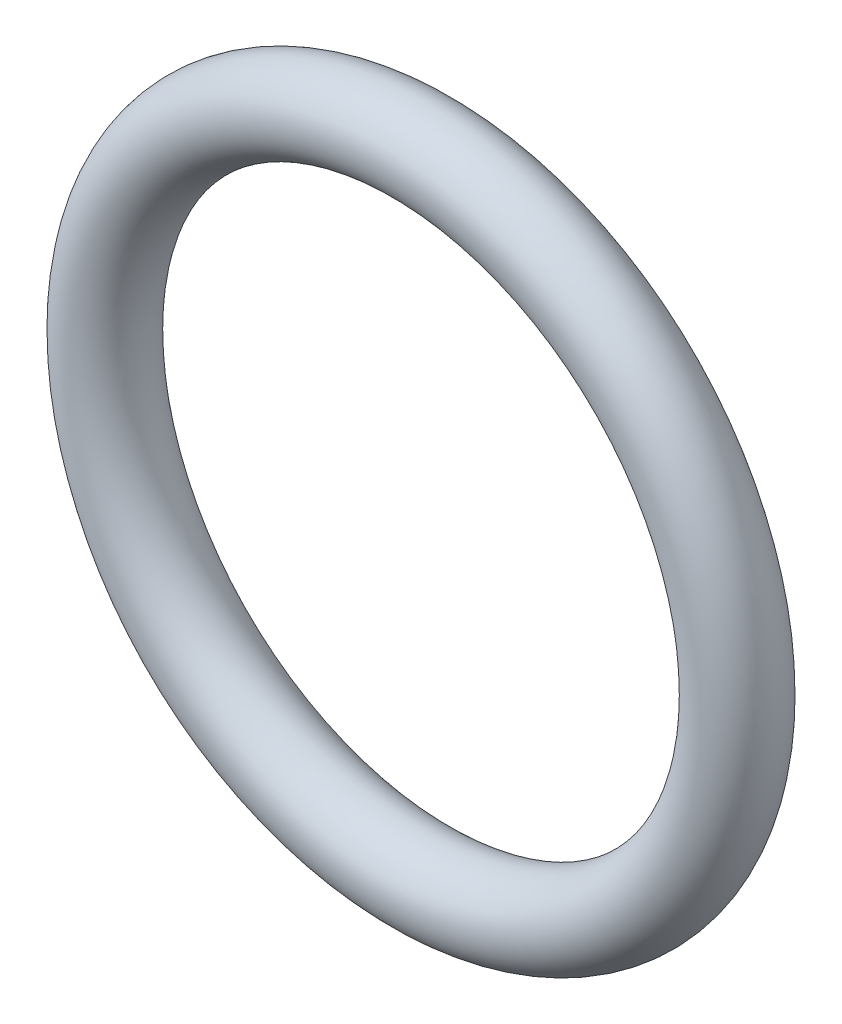
ISO-10303-21;
HEADER;
FILE_DESCRIPTION(('STEP AP214'),'2;1');
FILE_NAME('part.step','',(''),(''),'','','');
FILE_SCHEMA(('AUTOMOTIVE_DESIGN { 1 0 10303 214 1 1 1 1 }'));
ENDSEC;
DATA;
#1=APPLICATION_CONTEXT('core data for automotive mechanical design processes');
#2=APPLICATION_PROTOCOL_DEFINITION('international standard','automotive_design',2000,#1);
#3=PRODUCT_CONTEXT('',#1,'mechanical');
#4=PRODUCT('Part','Part','',(#3));
#5=PRODUCT_RELATED_PRODUCT_CATEGORY('part','',(#4));
#6=PRODUCT_DEFINITION_FORMATION('','',#4);
#7=PRODUCT_DEFINITION_CONTEXT('part definition',#1,'design');
#8=PRODUCT_DEFINITION('design','',#6,#7);
#9=PRODUCT_DEFINITION_SHAPE('','',#8);
#10=(LENGTH_UNIT() NAMED_UNIT(*) SI_UNIT(.MILLI.,.METRE.));
#11=(NAMED_UNIT(*) PLANE_ANGLE_UNIT() SI_UNIT($,.RADIAN.));
#12=(NAMED_UNIT(*) SI_UNIT($,.STERADIAN.) SOLID_ANGLE_UNIT());
#13=UNCERTAINTY_MEASURE_WITH_UNIT(LENGTH_MEASURE(1.E-05),#10,'distance_accuracy_value','');
#14=(GEOMETRIC_REPRESENTATION_CONTEXT(3) GLOBAL_UNCERTAINTY_ASSIGNED_CONTEXT((#13)) GLOBAL_UNIT_ASSIGNED_CONTEXT((#10,
#11,#12)) REPRESENTATION_CONTEXT('',''));
#15=CARTESIAN_POINT('',(0.,0.,0.));
#16=DIRECTION('',(0.,0.,1.));
#17=DIRECTION('',(1.,0.,0.));
#18=AXIS2_PLACEMENT_3D('',#15,#16,#17);
#19=CARTESIAN_POINT('',(0.,0.,0.));
#20=DIRECTION('',(0.,0.,-1.));
#21=DIRECTION('',(-1.,0.,0.));
#22=AXIS2_PLACEMENT_3D('',#19,#20,#21);
#23=TOROIDAL_SURFACE('',#22,14.224,1.84149999999999);
#24=CARTESIAN_POINT('',(-16.0655,0.,0.));
#25=VERTEX_POINT('',#24);
#26=VERTEX_LOOP('',#25);
#27=FACE_BOUND('',#26,.T.);
#28=ADVANCED_FACE('F28',(#27),#23,.T.);
#29=CLOSED_SHELL('',(#28));
#30=MANIFOLD_SOLID_BREP('B2',#29);
#31=ADVANCED_BREP_SHAPE_REPRESENTATION('',(#18,#30),#14);
#32=SHAPE_DEFINITION_REPRESENTATION(#9,#31);
ENDSEC;
END-ISO-10303-21;
